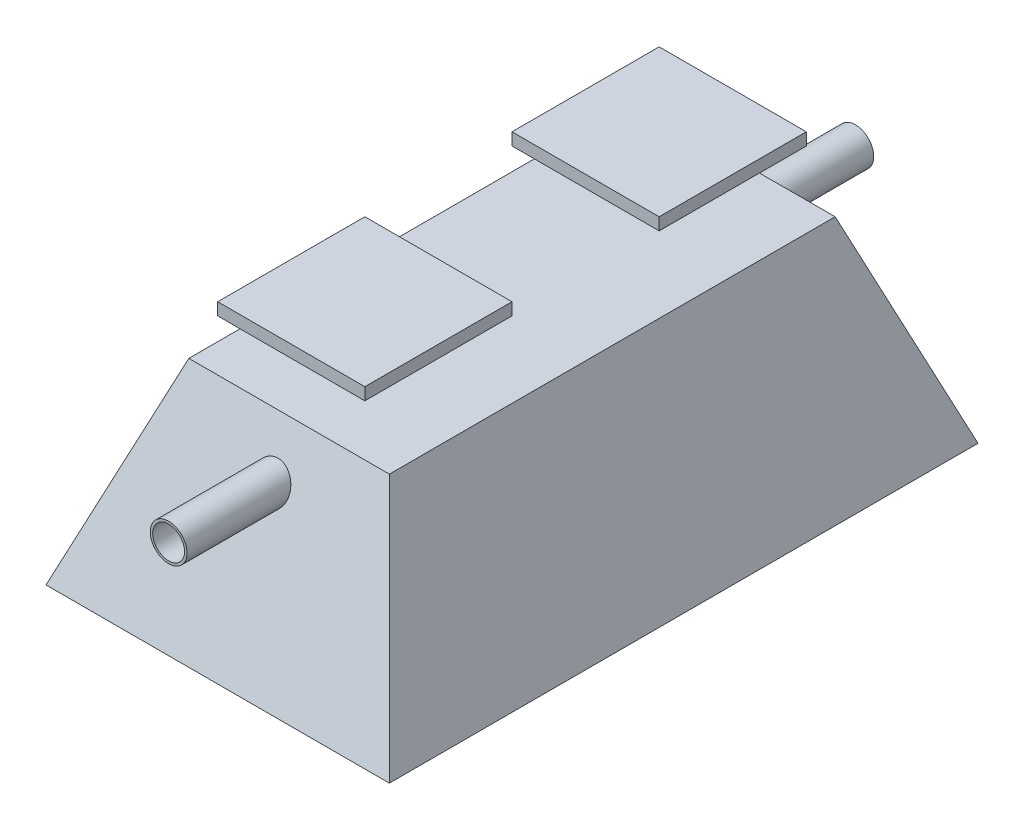
ISO-10303-21;
HEADER;
FILE_DESCRIPTION(('STEP AP214'),'2;1');
FILE_NAME('part.step','',(''),(''),'','','');
FILE_SCHEMA(('AUTOMOTIVE_DESIGN { 1 0 10303 214 1 1 1 1 }'));
ENDSEC;
DATA;
#1=APPLICATION_CONTEXT('core data for automotive mechanical design processes');
#2=APPLICATION_PROTOCOL_DEFINITION('international standard','automotive_design',2000,#1);
#3=PRODUCT_CONTEXT('',#1,'mechanical');
#4=PRODUCT('Part','Part','',(#3));
#5=PRODUCT_RELATED_PRODUCT_CATEGORY('part','',(#4));
#6=PRODUCT_DEFINITION_FORMATION('','',#4);
#7=PRODUCT_DEFINITION_CONTEXT('part definition',#1,'design');
#8=PRODUCT_DEFINITION('design','',#6,#7);
#9=PRODUCT_DEFINITION_SHAPE('','',#8);
#10=(LENGTH_UNIT() NAMED_UNIT(*) SI_UNIT(.MILLI.,.METRE.));
#11=(NAMED_UNIT(*) PLANE_ANGLE_UNIT() SI_UNIT($,.RADIAN.));
#12=(NAMED_UNIT(*) SI_UNIT($,.STERADIAN.) SOLID_ANGLE_UNIT());
#13=UNCERTAINTY_MEASURE_WITH_UNIT(LENGTH_MEASURE(1.E-05),#10,'distance_accuracy_value','');
#14=(GEOMETRIC_REPRESENTATION_CONTEXT(3) GLOBAL_UNCERTAINTY_ASSIGNED_CONTEXT((#13)) GLOBAL_UNIT_ASSIGNED_CONTEXT((#10,
#11,#12)) REPRESENTATION_CONTEXT('',''));
#15=CARTESIAN_POINT('',(0.,0.,0.));
#16=DIRECTION('',(0.,0.,1.));
#17=DIRECTION('',(1.,0.,0.));
#18=AXIS2_PLACEMENT_3D('',#15,#16,#17);
#19=CARTESIAN_POINT('',(175.096988457911,2.54,302.096988457911));
#20=DIRECTION('',(1.,0.,0.));
#21=DIRECTION('',(0.,0.,-1.));
#22=AXIS2_PLACEMENT_3D('',#19,#20,#21);
#23=PLANE('',#22);
#24=DIRECTION('',(0.,0.,1.));
#25=VECTOR('',#24,1.);
#26=CARTESIAN_POINT('',(175.096988457911,0.,302.096988457911));
#27=LINE('',#26,#25);
#28=CARTESIAN_POINT('',(175.096988457911,0.,-302.096988457911));
#29=VERTEX_POINT('',#28);
#30=CARTESIAN_POINT('',(175.096988457911,0.,302.096988457911));
#31=VERTEX_POINT('',#30);
#32=EDGE_CURVE('E112',#29,#31,#27,.T.);
#33=ORIENTED_EDGE('',*,*,#32,.F.);
#34=DIRECTION('',(0.,-1.,0.));
#35=VECTOR('',#34,1.);
#36=CARTESIAN_POINT('',(175.096988457911,2.54,-302.096988457911));
#37=LINE('',#36,#35);
#38=CARTESIAN_POINT('',(175.096988457911,2.54,-302.096988457911));
#39=VERTEX_POINT('',#38);
#40=EDGE_CURVE('E12',#39,#29,#37,.T.);
#41=ORIENTED_EDGE('',*,*,#40,.F.);
#42=DIRECTION('',(0.,0.,1.));
#43=VECTOR('',#42,1.);
#44=CARTESIAN_POINT('',(175.096988457911,2.54,302.096988457911));
#45=LINE('',#44,#43);
#46=CARTESIAN_POINT('',(175.096988457911,2.54,302.096988457911));
#47=VERTEX_POINT('',#46);
#48=EDGE_CURVE('E106',#39,#47,#45,.T.);
#49=ORIENTED_EDGE('',*,*,#48,.T.);
#50=DIRECTION('',(0.,-1.,0.));
#51=VECTOR('',#50,1.);
#52=CARTESIAN_POINT('',(175.096988457911,2.54,302.096988457911));
#53=LINE('',#52,#51);
#54=EDGE_CURVE('E51',#47,#31,#53,.T.);
#55=ORIENTED_EDGE('',*,*,#54,.T.);
#56=EDGE_LOOP('',(#33,#41,#49,#55));
#57=FACE_BOUND('',#56,.T.);
#58=ADVANCED_FACE('F48',(#57),#23,.T.);
#59=CARTESIAN_POINT('',(175.096988457911,2.54,-302.096988457911));
#60=DIRECTION('',(0.,0.,-1.));
#61=DIRECTION('',(-1.,0.,0.));
#62=AXIS2_PLACEMENT_3D('',#59,#60,#61);
#63=PLANE('',#62);
#64=DIRECTION('',(1.,0.,0.));
#65=VECTOR('',#64,1.);
#66=CARTESIAN_POINT('',(175.096988457911,0.,-302.096988457911));
#67=LINE('',#66,#65);
#68=CARTESIAN_POINT('',(-175.096988457911,0.,-302.096988457911));
#69=VERTEX_POINT('',#68);
#70=EDGE_CURVE('E108',#69,#29,#67,.T.);
#71=ORIENTED_EDGE('',*,*,#70,.F.);
#72=DIRECTION('',(0.,-1.,0.));
#73=VECTOR('',#72,1.);
#74=CARTESIAN_POINT('',(-175.096988457911,2.54,-302.096988457911));
#75=LINE('',#74,#73);
#76=CARTESIAN_POINT('',(-175.096988457911,2.54,-302.096988457911));
#77=VERTEX_POINT('',#76);
#78=EDGE_CURVE('E57',#77,#69,#75,.T.);
#79=ORIENTED_EDGE('',*,*,#78,.F.);
#80=DIRECTION('',(1.,0.,0.));
#81=VECTOR('',#80,1.);
#82=CARTESIAN_POINT('',(175.096988457911,2.54,-302.096988457911));
#83=LINE('',#82,#81);
#84=EDGE_CURVE('E103',#77,#39,#83,.T.);
#85=ORIENTED_EDGE('',*,*,#84,.T.);
#86=ORIENTED_EDGE('',*,*,#40,.T.);
#87=EDGE_LOOP('',(#71,#79,#85,#86));
#88=FACE_BOUND('',#87,.T.);
#89=ADVANCED_FACE('F122',(#88),#63,.T.);
#90=CARTESIAN_POINT('',(-175.096988457911,2.54,-302.096988457911));
#91=DIRECTION('',(-1.,0.,0.));
#92=DIRECTION('',(0.,0.,1.));
#93=AXIS2_PLACEMENT_3D('',#90,#91,#92);
#94=PLANE('',#93);
#95=DIRECTION('',(0.,0.,-1.));
#96=VECTOR('',#95,1.);
#97=CARTESIAN_POINT('',(-175.096988457911,0.,-302.096988457911));
#98=LINE('',#97,#96);
#99=CARTESIAN_POINT('',(-175.096988457911,0.,302.096988457911));
#100=VERTEX_POINT('',#99);
#101=EDGE_CURVE('E98',#100,#69,#98,.T.);
#102=ORIENTED_EDGE('',*,*,#101,.F.);
#103=DIRECTION('',(0.,-1.,0.));
#104=VECTOR('',#103,1.);
#105=CARTESIAN_POINT('',(-175.096988457911,2.54,302.096988457911));
#106=LINE('',#105,#104);
#107=CARTESIAN_POINT('',(-175.096988457911,2.54,302.096988457911));
#108=VERTEX_POINT('',#107);
#109=EDGE_CURVE('E93',#108,#100,#106,.T.);
#110=ORIENTED_EDGE('',*,*,#109,.F.);
#111=DIRECTION('',(0.,0.,-1.));
#112=VECTOR('',#111,1.);
#113=CARTESIAN_POINT('',(-175.096988457911,2.54,-302.096988457911));
#114=LINE('',#113,#112);
#115=EDGE_CURVE('E96',#108,#77,#114,.T.);
#116=ORIENTED_EDGE('',*,*,#115,.T.);
#117=ORIENTED_EDGE('',*,*,#78,.T.);
#118=EDGE_LOOP('',(#102,#110,#116,#117));
#119=FACE_BOUND('',#118,.T.);
#120=ADVANCED_FACE('F95',(#119),#94,.T.);
#121=CARTESIAN_POINT('',(-175.096988457911,2.54,302.096988457911));
#122=DIRECTION('',(0.,0.,1.));
#123=DIRECTION('',(1.,0.,0.));
#124=AXIS2_PLACEMENT_3D('',#121,#122,#123);
#125=PLANE('',#124);
#126=DIRECTION('',(-1.,0.,0.));
#127=VECTOR('',#126,1.);
#128=CARTESIAN_POINT('',(-175.096988457911,0.,302.096988457911));
#129=LINE('',#128,#127);
#130=EDGE_CURVE('E115',#31,#100,#129,.T.);
#131=ORIENTED_EDGE('',*,*,#130,.F.);
#132=ORIENTED_EDGE('',*,*,#54,.F.);
#133=DIRECTION('',(-1.,0.,0.));
#134=VECTOR('',#133,1.);
#135=CARTESIAN_POINT('',(-175.096988457911,2.54,302.096988457911));
#136=LINE('',#135,#134);
#137=EDGE_CURVE('E102',#47,#108,#136,.T.);
#138=ORIENTED_EDGE('',*,*,#137,.T.);
#139=ORIENTED_EDGE('',*,*,#109,.T.);
#140=EDGE_LOOP('',(#131,#132,#138,#139));
#141=FACE_BOUND('',#140,.T.);
#142=ADVANCED_FACE('F105',(#141),#125,.T.);
#143=CARTESIAN_POINT('',(0.,2.54,0.));
#144=DIRECTION('',(0.,1.,0.));
#145=DIRECTION('',(0.,0.,1.));
#146=AXIS2_PLACEMENT_3D('',#143,#144,#145);
#147=PLANE('',#146);
#148=ORIENTED_EDGE('',*,*,#48,.F.);
#149=ORIENTED_EDGE('',*,*,#84,.F.);
#150=ORIENTED_EDGE('',*,*,#115,.F.);
#151=ORIENTED_EDGE('',*,*,#137,.F.);
#152=EDGE_LOOP('',(#148,#149,#150,#151));
#153=FACE_BOUND('',#152,.T.);
#154=ADVANCED_FACE('F101',(#153),#147,.T.);
#155=CARTESIAN_POINT('',(0.,0.,0.));
#156=DIRECTION('',(0.,1.,0.));
#157=DIRECTION('',(0.,0.,1.));
#158=AXIS2_PLACEMENT_3D('',#155,#156,#157);
#159=PLANE('',#158);
#160=ORIENTED_EDGE('',*,*,#32,.T.);
#161=ORIENTED_EDGE('',*,*,#130,.T.);
#162=ORIENTED_EDGE('',*,*,#101,.T.);
#163=ORIENTED_EDGE('',*,*,#70,.T.);
#164=EDGE_LOOP('',(#160,#161,#162,#163));
#165=FACE_BOUND('',#164,.T.);
#166=ADVANCED_FACE('F121',(#165),#159,.F.);
#167=CLOSED_SHELL('',(#58,#89,#120,#142,#154,#166));
#168=MANIFOLD_SOLID_BREP('B2',#167);
#169=CARTESIAN_POINT('',(177.8,0.,-304.8));
#170=DIRECTION('',(0.939692620785908,0.342020143325669,0.));
#171=DIRECTION('',(-0.342020143325669,0.939692620785908,0.));
#172=AXIS2_PLACEMENT_3D('',#169,#170,#171);
#173=PLANE('',#172);
#174=DIRECTION('',(0.,0.,-1.));
#175=VECTOR('',#174,1.);
#176=CARTESIAN_POINT('',(177.8,0.,-304.8));
#177=LINE('',#176,#175);
#178=CARTESIAN_POINT('',(177.8,0.,304.8));
#179=VERTEX_POINT('',#178);
#180=CARTESIAN_POINT('',(177.8,0.,-304.8));
#181=VERTEX_POINT('',#180);
#182=EDGE_CURVE('E409',#179,#181,#177,.T.);
#183=ORIENTED_EDGE('',*,*,#182,.T.);
#184=DIRECTION('',(0.323615577118185,-0.889126490715988,-0.323615577118185));
#185=VECTOR('',#184,1.);
#186=CARTESIAN_POINT('',(140.559063952443,102.318630870018,-267.559063952443));
#187=LINE('',#186,#185);
#188=CARTESIAN_POINT('',(103.841248397107,203.2,-230.841248397108));
#189=VERTEX_POINT('',#188);
#190=EDGE_CURVE('E46',#189,#181,#187,.T.);
#191=ORIENTED_EDGE('',*,*,#190,.F.);
#192=DIRECTION('',(0.,0.,1.));
#193=VECTOR('',#192,1.);
#194=CARTESIAN_POINT('',(103.841248397107,203.2,-304.8));
#195=LINE('',#194,#193);
#196=CARTESIAN_POINT('',(103.841248397107,203.2,230.841248397108));
#197=VERTEX_POINT('',#196);
#198=EDGE_CURVE('E417',#197,#189,#195,.F.);
#199=ORIENTED_EDGE('',*,*,#198,.F.);
#200=DIRECTION('',(0.323615577118185,-0.889126490715988,0.323615577118185));
#201=VECTOR('',#200,1.);
#202=CARTESIAN_POINT('',(113.958395347044,175.403367205744,240.958395347044));
#203=LINE('',#202,#201);
#204=EDGE_CURVE('E419',#197,#179,#203,.T.);
#205=ORIENTED_EDGE('',*,*,#204,.T.);
#206=EDGE_LOOP('',(#183,#191,#199,#205));
#207=FACE_BOUND('',#206,.T.);
#208=ADVANCED_FACE('F171',(#207),#173,.T.);
#209=CARTESIAN_POINT('',(-177.8,0.,-304.8));
#210=DIRECTION('',(0.,0.342020143325669,-0.939692620785908));
#211=DIRECTION('',(0.,0.939692620785908,0.342020143325669));
#212=AXIS2_PLACEMENT_3D('',#209,#210,#211);
#213=PLANE('',#212);
#214=CARTESIAN_POINT('',(0.,152.4,-249.330936297831));
#215=DIRECTION('',(0.,0.342020143325669,-0.939692620785908));
#216=DIRECTION('',(0.,0.939692620785908,0.342020143325669));
#217=AXIS2_PLACEMENT_3D('',#214,#215,#216);
#218=ELLIPSE('',#217,20.2725865656661,19.05);
#219=CARTESIAN_POINT('',(0.,171.45,-242.397303335059));
#220=VERTEX_POINT('',#219);
#221=EDGE_CURVE('E406',#220,#220,#218,.F.);
#222=ORIENTED_EDGE('',*,*,#221,.T.);
#223=EDGE_LOOP('',(#222));
#224=FACE_BOUND('',#223,.T.);
#225=DIRECTION('',(-1.,0.,0.));
#226=VECTOR('',#225,1.);
#227=CARTESIAN_POINT('',(-177.8,0.,-304.8));
#228=LINE('',#227,#226);
#229=CARTESIAN_POINT('',(-177.8,0.,-304.8));
#230=VERTEX_POINT('',#229);
#231=EDGE_CURVE('E412',#181,#230,#228,.T.);
#232=ORIENTED_EDGE('',*,*,#231,.T.);
#233=DIRECTION('',(-0.323615577118185,-0.889126490715988,-0.323615577118185));
#234=VECTOR('',#233,1.);
#235=CARTESIAN_POINT('',(-177.8,0.,-304.8));
#236=LINE('',#235,#234);
#237=CARTESIAN_POINT('',(-103.841248397108,203.2,-230.841248397108));
#238=VERTEX_POINT('',#237);
#239=EDGE_CURVE('E180',#238,#230,#236,.T.);
#240=ORIENTED_EDGE('',*,*,#239,.F.);
#241=DIRECTION('',(1.,0.,0.));
#242=VECTOR('',#241,1.);
#243=CARTESIAN_POINT('',(-177.8,203.2,-230.841248397108));
#244=LINE('',#243,#242);
#245=EDGE_CURVE('E428',#189,#238,#244,.F.);
#246=ORIENTED_EDGE('',*,*,#245,.F.);
#247=ORIENTED_EDGE('',*,*,#190,.T.);
#248=EDGE_LOOP('',(#232,#240,#246,#247));
#249=FACE_BOUND('',#248,.T.);
#250=ADVANCED_FACE('F173',(#224,#249),#213,.T.);
#251=CARTESIAN_POINT('',(-177.8,0.,-304.8));
#252=DIRECTION('',(-0.939692620785908,0.342020143325669,0.));
#253=DIRECTION('',(-0.342020143325669,-0.939692620785908,0.));
#254=AXIS2_PLACEMENT_3D('',#251,#252,#253);
#255=PLANE('',#254);
#256=DIRECTION('',(0.,0.,1.));
#257=VECTOR('',#256,1.);
#258=CARTESIAN_POINT('',(-177.8,0.,-304.8));
#259=LINE('',#258,#257);
#260=CARTESIAN_POINT('',(-177.8,0.,304.8));
#261=VERTEX_POINT('',#260);
#262=EDGE_CURVE('E414',#230,#261,#259,.T.);
#263=ORIENTED_EDGE('',*,*,#262,.T.);
#264=DIRECTION('',(-0.323615577118185,-0.889126490715988,0.323615577118185));
#265=VECTOR('',#264,1.);
#266=CARTESIAN_POINT('',(-177.8,0.,304.8));
#267=LINE('',#266,#265);
#268=CARTESIAN_POINT('',(-103.841248397108,203.2,230.841248397108));
#269=VERTEX_POINT('',#268);
#270=EDGE_CURVE('E422',#269,#261,#267,.T.);
#271=ORIENTED_EDGE('',*,*,#270,.F.);
#272=DIRECTION('',(0.,0.,-1.));
#273=VECTOR('',#272,1.);
#274=CARTESIAN_POINT('',(-103.841248397108,203.2,-304.8));
#275=LINE('',#274,#273);
#276=EDGE_CURVE('E430',#238,#269,#275,.F.);
#277=ORIENTED_EDGE('',*,*,#276,.F.);
#278=ORIENTED_EDGE('',*,*,#239,.T.);
#279=EDGE_LOOP('',(#263,#271,#277,#278));
#280=FACE_BOUND('',#279,.T.);
#281=ADVANCED_FACE('F436',(#280),#255,.T.);
#282=CARTESIAN_POINT('',(-177.8,0.,304.8));
#283=DIRECTION('',(0.,0.342020143325669,0.939692620785908));
#284=DIRECTION('',(0.,-0.939692620785908,0.342020143325669));
#285=AXIS2_PLACEMENT_3D('',#282,#283,#284);
#286=PLANE('',#285);
#287=CARTESIAN_POINT('',(0.,152.4,249.330936297831));
#288=DIRECTION('',(0.,0.342020143325669,0.939692620785908));
#289=DIRECTION('',(0.,-0.939692620785908,0.342020143325669));
#290=AXIS2_PLACEMENT_3D('',#287,#288,#289);
#291=ELLIPSE('',#290,20.2725865656661,19.05);
#292=CARTESIAN_POINT('',(0.,133.35,256.264569260602));
#293=VERTEX_POINT('',#292);
#294=EDGE_CURVE('E175',#293,#293,#291,.F.);
#295=ORIENTED_EDGE('',*,*,#294,.T.);
#296=EDGE_LOOP('',(#295));
#297=FACE_BOUND('',#296,.T.);
#298=DIRECTION('',(1.,0.,0.));
#299=VECTOR('',#298,1.);
#300=CARTESIAN_POINT('',(-177.8,0.,304.8));
#301=LINE('',#300,#299);
#302=EDGE_CURVE('E416',#261,#179,#301,.T.);
#303=ORIENTED_EDGE('',*,*,#302,.T.);
#304=ORIENTED_EDGE('',*,*,#204,.F.);
#305=DIRECTION('',(-1.,0.,0.));
#306=VECTOR('',#305,1.);
#307=CARTESIAN_POINT('',(-177.8,203.2,230.841248397108));
#308=LINE('',#307,#306);
#309=EDGE_CURVE('E196',#269,#197,#308,.F.);
#310=ORIENTED_EDGE('',*,*,#309,.F.);
#311=ORIENTED_EDGE('',*,*,#270,.T.);
#312=EDGE_LOOP('',(#303,#304,#310,#311));
#313=FACE_BOUND('',#312,.T.);
#314=ADVANCED_FACE('F440',(#297,#313),#286,.T.);
#315=CARTESIAN_POINT('',(0.,203.2,0.));
#316=DIRECTION('',(0.,1.,0.));
#317=DIRECTION('',(0.,0.,1.));
#318=AXIS2_PLACEMENT_3D('',#315,#316,#317);
#319=PLANE('',#318);
#320=CARTESIAN_POINT('',(0.,203.2,152.4));
#321=DIRECTION('',(0.,1.,0.));
#322=DIRECTION('',(0.,0.,1.));
#323=AXIS2_PLACEMENT_3D('',#320,#321,#322);
#324=CIRCLE('',#323,6.35);
#325=CARTESIAN_POINT('',(0.,203.2,158.75));
#326=VERTEX_POINT('',#325);
#327=EDGE_CURVE('E348',#326,#326,#324,.T.);
#328=ORIENTED_EDGE('',*,*,#327,.F.);
#329=EDGE_LOOP('',(#328));
#330=FACE_BOUND('',#329,.T.);
#331=CARTESIAN_POINT('',(0.,203.2,-152.4));
#332=DIRECTION('',(0.,1.,0.));
#333=DIRECTION('',(0.,0.,1.));
#334=AXIS2_PLACEMENT_3D('',#331,#332,#333);
#335=CIRCLE('',#334,6.35);
#336=CARTESIAN_POINT('',(0.,203.2,-146.05));
#337=VERTEX_POINT('',#336);
#338=EDGE_CURVE('E352',#337,#337,#335,.T.);
#339=ORIENTED_EDGE('',*,*,#338,.F.);
#340=EDGE_LOOP('',(#339));
#341=FACE_BOUND('',#340,.T.);
#342=ORIENTED_EDGE('',*,*,#198,.T.);
#343=ORIENTED_EDGE('',*,*,#245,.T.);
#344=ORIENTED_EDGE('',*,*,#276,.T.);
#345=ORIENTED_EDGE('',*,*,#309,.T.);
#346=EDGE_LOOP('',(#342,#343,#344,#345));
#347=FACE_BOUND('',#346,.T.);
#348=ADVANCED_FACE('F433',(#330,#341,#347),#319,.T.);
#349=CARTESIAN_POINT('',(0.,0.,0.));
#350=DIRECTION('',(0.,1.,0.));
#351=DIRECTION('',(0.,0.,1.));
#352=AXIS2_PLACEMENT_3D('',#349,#350,#351);
#353=PLANE('',#352);
#354=DIRECTION('',(-1.,0.,0.));
#355=VECTOR('',#354,1.);
#356=CARTESIAN_POINT('',(-177.8,0.,302.096988457911));
#357=LINE('',#356,#355);
#358=CARTESIAN_POINT('',(-175.096988457911,0.,302.096988457911));
#359=VERTEX_POINT('',#358);
#360=CARTESIAN_POINT('',(175.096988457911,0.,302.096988457911));
#361=VERTEX_POINT('',#360);
#362=EDGE_CURVE('E376',#359,#361,#357,.F.);
#363=ORIENTED_EDGE('',*,*,#362,.T.);
#364=DIRECTION('',(0.,0.,1.));
#365=VECTOR('',#364,1.);
#366=CARTESIAN_POINT('',(175.096988457911,0.,-304.8));
#367=LINE('',#366,#365);
#368=CARTESIAN_POINT('',(175.096988457911,0.,-302.096988457911));
#369=VERTEX_POINT('',#368);
#370=EDGE_CURVE('E384',#361,#369,#367,.F.);
#371=ORIENTED_EDGE('',*,*,#370,.T.);
#372=DIRECTION('',(1.,0.,0.));
#373=VECTOR('',#372,1.);
#374=CARTESIAN_POINT('',(-177.8,0.,-302.096988457911));
#375=LINE('',#374,#373);
#376=CARTESIAN_POINT('',(-175.096988457911,0.,-302.096988457911));
#377=VERTEX_POINT('',#376);
#378=EDGE_CURVE('E395',#369,#377,#375,.F.);
#379=ORIENTED_EDGE('',*,*,#378,.T.);
#380=DIRECTION('',(0.,0.,-1.));
#381=VECTOR('',#380,1.);
#382=CARTESIAN_POINT('',(-175.096988457911,0.,-304.8));
#383=LINE('',#382,#381);
#384=EDGE_CURVE('E188',#377,#359,#383,.F.);
#385=ORIENTED_EDGE('',*,*,#384,.T.);
#386=EDGE_LOOP('',(#363,#371,#379,#385));
#387=FACE_BOUND('',#386,.T.);
#388=ORIENTED_EDGE('',*,*,#182,.F.);
#389=ORIENTED_EDGE('',*,*,#302,.F.);
#390=ORIENTED_EDGE('',*,*,#262,.F.);
#391=ORIENTED_EDGE('',*,*,#231,.F.);
#392=EDGE_LOOP('',(#388,#389,#390,#391));
#393=FACE_BOUND('',#392,.T.);
#394=ADVANCED_FACE('F447',(#387,#393),#353,.F.);
#395=CARTESIAN_POINT('',(0.,152.4,-355.6));
#396=DIRECTION('',(0.,0.,1.));
#397=DIRECTION('',(1.,0.,0.));
#398=AXIS2_PLACEMENT_3D('',#395,#396,#397);
#399=CYLINDRICAL_SURFACE('',#398,19.05);
#400=CARTESIAN_POINT('',(0.,152.4,355.6));
#401=DIRECTION('',(0.,0.,1.));
#402=DIRECTION('',(1.,0.,0.));
#403=AXIS2_PLACEMENT_3D('',#400,#401,#402);
#404=CIRCLE('',#403,19.05);
#405=CARTESIAN_POINT('',(19.05,152.4,355.6));
#406=VERTEX_POINT('',#405);
#407=EDGE_CURVE('E370',#406,#406,#404,.T.);
#408=ORIENTED_EDGE('',*,*,#407,.F.);
#409=EDGE_LOOP('',(#408));
#410=FACE_BOUND('',#409,.T.);
#411=ORIENTED_EDGE('',*,*,#294,.F.);
#412=EDGE_LOOP('',(#411));
#413=FACE_BOUND('',#412,.T.);
#414=ADVANCED_FACE('F449',(#410,#413),#399,.T.);
#415=CARTESIAN_POINT('',(0.,152.4,355.6));
#416=DIRECTION('',(0.,0.,1.));
#417=DIRECTION('',(1.,0.,0.));
#418=AXIS2_PLACEMENT_3D('',#415,#416,#417);
#419=PLANE('',#418);
#420=CARTESIAN_POINT('',(0.,152.4,355.6));
#421=DIRECTION('',(0.,0.,-1.));
#422=DIRECTION('',(-1.,0.,0.));
#423=AXIS2_PLACEMENT_3D('',#420,#421,#422);
#424=CIRCLE('',#423,16.51);
#425=CARTESIAN_POINT('',(-16.51,152.4,355.6));
#426=VERTEX_POINT('',#425);
#427=EDGE_CURVE('E363',#426,#426,#424,.T.);
#428=ORIENTED_EDGE('',*,*,#427,.T.);
#429=EDGE_LOOP('',(#428));
#430=FACE_BOUND('',#429,.T.);
#431=ORIENTED_EDGE('',*,*,#407,.T.);
#432=EDGE_LOOP('',(#431));
#433=FACE_BOUND('',#432,.T.);
#434=ADVANCED_FACE('F456',(#430,#433),#419,.T.);
#435=CARTESIAN_POINT('',(0.,152.4,-355.6));
#436=DIRECTION('',(0.,0.,1.));
#437=DIRECTION('',(1.,0.,0.));
#438=AXIS2_PLACEMENT_3D('',#435,#436,#437);
#439=CIRCLE('',#438,19.05);
#440=CARTESIAN_POINT('',(19.05,152.4,-355.6));
#441=VERTEX_POINT('',#440);
#442=EDGE_CURVE('E403',#441,#441,#439,.T.);
#443=ORIENTED_EDGE('',*,*,#442,.T.);
#444=EDGE_LOOP('',(#443));
#445=FACE_BOUND('',#444,.T.);
#446=ORIENTED_EDGE('',*,*,#221,.F.);
#447=EDGE_LOOP('',(#446));
#448=FACE_BOUND('',#447,.T.);
#449=ADVANCED_FACE('F459',(#445,#448),#399,.T.);
#450=CARTESIAN_POINT('',(0.,152.4,-355.6));
#451=DIRECTION('',(0.,0.,1.));
#452=DIRECTION('',(1.,0.,0.));
#453=AXIS2_PLACEMENT_3D('',#450,#451,#452);
#454=PLANE('',#453);
#455=CARTESIAN_POINT('',(0.,152.4,-355.6));
#456=DIRECTION('',(0.,0.,-1.));
#457=DIRECTION('',(-1.,0.,0.));
#458=AXIS2_PLACEMENT_3D('',#455,#456,#457);
#459=CIRCLE('',#458,16.51);
#460=CARTESIAN_POINT('',(-16.51,152.4,-355.6));
#461=VERTEX_POINT('',#460);
#462=EDGE_CURVE('E358',#461,#461,#459,.T.);
#463=ORIENTED_EDGE('',*,*,#462,.F.);
#464=EDGE_LOOP('',(#463));
#465=FACE_BOUND('',#464,.T.);
#466=ORIENTED_EDGE('',*,*,#442,.F.);
#467=EDGE_LOOP('',(#466));
#468=FACE_BOUND('',#467,.T.);
#469=ADVANCED_FACE('F636',(#465,#468),#454,.F.);
#470=CARTESIAN_POINT('',(175.413180743204,-0.8687311640472,-304.8));
#471=DIRECTION('',(0.939692620785908,0.342020143325669,0.));
#472=DIRECTION('',(-0.342020143325669,0.939692620785908,0.));
#473=AXIS2_PLACEMENT_3D('',#470,#471,#472);
#474=PLANE('',#473);
#475=ORIENTED_EDGE('',*,*,#370,.F.);
#476=DIRECTION('',(0.323615577118185,-0.889126490715988,0.323615577118185));
#477=VECTOR('',#476,1.);
#478=CARTESIAN_POINT('',(111.821540610213,173.847864167429,238.821540610213));
#479=LINE('',#478,#477);
#480=CARTESIAN_POINT('',(102.062721250055,200.66,229.062721250055));
#481=VERTEX_POINT('',#480);
#482=EDGE_CURVE('E377',#481,#361,#479,.T.);
#483=ORIENTED_EDGE('',*,*,#482,.F.);
#484=DIRECTION('',(0.,0.,1.));
#485=VECTOR('',#484,1.);
#486=CARTESIAN_POINT('',(102.062721250055,200.66,-304.8));
#487=LINE('',#486,#485);
#488=CARTESIAN_POINT('',(102.062721250055,200.66,-229.062721250055));
#489=VERTEX_POINT('',#488);
#490=EDGE_CURVE('E372',#481,#489,#487,.F.);
#491=ORIENTED_EDGE('',*,*,#490,.T.);
#492=DIRECTION('',(0.323615577118185,-0.889126490715988,-0.323615577118185));
#493=VECTOR('',#492,1.);
#494=CARTESIAN_POINT('',(138.422209215611,100.763127831703,-265.422209215611));
#495=LINE('',#494,#493);
#496=EDGE_CURVE('E367',#489,#369,#495,.T.);
#497=ORIENTED_EDGE('',*,*,#496,.T.);
#498=EDGE_LOOP('',(#475,#483,#491,#497));
#499=FACE_BOUND('',#498,.T.);
#500=ADVANCED_FACE('F632',(#499),#474,.F.);
#501=CARTESIAN_POINT('',(-177.8,-0.8687311640472,-302.413180743204));
#502=DIRECTION('',(0.,0.342020143325669,-0.939692620785908));
#503=DIRECTION('',(0.,0.939692620785908,0.342020143325669));
#504=AXIS2_PLACEMENT_3D('',#501,#502,#503);
#505=PLANE('',#504);
#506=CARTESIAN_POINT('',(0.,152.4,-246.627924755742));
#507=DIRECTION('',(0.,0.342020143325669,-0.939692620785908));
#508=DIRECTION('',(0.,0.939692620785908,0.342020143325669));
#509=AXIS2_PLACEMENT_3D('',#506,#507,#508);
#510=ELLIPSE('',#509,17.5695750235773,16.51);
#511=CARTESIAN_POINT('',(0.,168.91,-240.618776188007));
#512=VERTEX_POINT('',#511);
#513=EDGE_CURVE('E381',#512,#512,#510,.F.);
#514=ORIENTED_EDGE('',*,*,#513,.F.);
#515=EDGE_LOOP('',(#514));
#516=FACE_BOUND('',#515,.T.);
#517=ORIENTED_EDGE('',*,*,#378,.F.);
#518=ORIENTED_EDGE('',*,*,#496,.F.);
#519=DIRECTION('',(1.,0.,0.));
#520=VECTOR('',#519,1.);
#521=CARTESIAN_POINT('',(-177.8,200.66,-229.062721250055));
#522=LINE('',#521,#520);
#523=CARTESIAN_POINT('',(-102.062721250055,200.66,-229.062721250055));
#524=VERTEX_POINT('',#523);
#525=EDGE_CURVE('E375',#489,#524,#522,.F.);
#526=ORIENTED_EDGE('',*,*,#525,.T.);
#527=DIRECTION('',(-0.323615577118185,-0.889126490715988,-0.323615577118185));
#528=VECTOR('',#527,1.);
#529=CARTESIAN_POINT('',(-175.663145263169,-1.55550303831485,-302.663145263168));
#530=LINE('',#529,#528);
#531=EDGE_CURVE('E371',#524,#377,#530,.T.);
#532=ORIENTED_EDGE('',*,*,#531,.T.);
#533=EDGE_LOOP('',(#517,#518,#526,#532));
#534=FACE_BOUND('',#533,.T.);
#535=ADVANCED_FACE('F635',(#516,#534),#505,.F.);
#536=CARTESIAN_POINT('',(-175.413180743204,-0.8687311640472,-304.8));
#537=DIRECTION('',(-0.939692620785908,0.342020143325669,0.));
#538=DIRECTION('',(-0.342020143325669,-0.939692620785908,0.));
#539=AXIS2_PLACEMENT_3D('',#536,#537,#538);
#540=PLANE('',#539);
#541=ORIENTED_EDGE('',*,*,#384,.F.);
#542=ORIENTED_EDGE('',*,*,#531,.F.);
#543=DIRECTION('',(0.,0.,-1.));
#544=VECTOR('',#543,1.);
#545=CARTESIAN_POINT('',(-102.062721250055,200.66,-304.8));
#546=LINE('',#545,#544);
#547=CARTESIAN_POINT('',(-102.062721250055,200.66,229.062721250055));
#548=VERTEX_POINT('',#547);
#549=EDGE_CURVE('E387',#524,#548,#546,.F.);
#550=ORIENTED_EDGE('',*,*,#549,.T.);
#551=DIRECTION('',(-0.323615577118185,-0.889126490715988,0.323615577118185));
#552=VECTOR('',#551,1.);
#553=CARTESIAN_POINT('',(-175.663145263169,-1.55550303831486,302.663145263168));
#554=LINE('',#553,#552);
#555=EDGE_CURVE('E379',#548,#359,#554,.T.);
#556=ORIENTED_EDGE('',*,*,#555,.T.);
#557=EDGE_LOOP('',(#541,#542,#550,#556));
#558=FACE_BOUND('',#557,.T.);
#559=ADVANCED_FACE('F640',(#558),#540,.F.);
#560=CARTESIAN_POINT('',(-177.8,-0.8687311640472,302.413180743204));
#561=DIRECTION('',(0.,0.342020143325669,0.939692620785908));
#562=DIRECTION('',(0.,-0.939692620785908,0.342020143325669));
#563=AXIS2_PLACEMENT_3D('',#560,#561,#562);
#564=PLANE('',#563);
#565=CARTESIAN_POINT('',(0.,152.4,246.627924755742));
#566=DIRECTION('',(0.,0.342020143325669,0.939692620785908));
#567=DIRECTION('',(0.,-0.939692620785908,0.342020143325669));
#568=AXIS2_PLACEMENT_3D('',#565,#566,#567);
#569=ELLIPSE('',#568,17.5695750235773,16.51);
#570=CARTESIAN_POINT('',(0.,135.89,252.637073323477));
#571=VERTEX_POINT('',#570);
#572=EDGE_CURVE('E366',#571,#571,#569,.F.);
#573=ORIENTED_EDGE('',*,*,#572,.F.);
#574=EDGE_LOOP('',(#573));
#575=FACE_BOUND('',#574,.T.);
#576=ORIENTED_EDGE('',*,*,#362,.F.);
#577=ORIENTED_EDGE('',*,*,#555,.F.);
#578=DIRECTION('',(-1.,0.,0.));
#579=VECTOR('',#578,1.);
#580=CARTESIAN_POINT('',(-177.8,200.66,229.062721250055));
#581=LINE('',#580,#579);
#582=EDGE_CURVE('E380',#548,#481,#581,.F.);
#583=ORIENTED_EDGE('',*,*,#582,.T.);
#584=ORIENTED_EDGE('',*,*,#482,.T.);
#585=EDGE_LOOP('',(#576,#577,#583,#584));
#586=FACE_BOUND('',#585,.T.);
#587=ADVANCED_FACE('F644',(#575,#586),#564,.F.);
#588=CARTESIAN_POINT('',(0.,200.66,0.));
#589=DIRECTION('',(0.,1.,0.));
#590=DIRECTION('',(0.,0.,1.));
#591=AXIS2_PLACEMENT_3D('',#588,#589,#590);
#592=PLANE('',#591);
#593=ORIENTED_EDGE('',*,*,#490,.F.);
#594=ORIENTED_EDGE('',*,*,#582,.F.);
#595=ORIENTED_EDGE('',*,*,#549,.F.);
#596=ORIENTED_EDGE('',*,*,#525,.F.);
#597=EDGE_LOOP('',(#593,#594,#595,#596));
#598=FACE_BOUND('',#597,.T.);
#599=ADVANCED_FACE('F647',(#598),#592,.F.);
#600=CARTESIAN_POINT('',(0.,152.4,-355.6));
#601=DIRECTION('',(0.,0.,1.));
#602=DIRECTION('',(1.,0.,0.));
#603=AXIS2_PLACEMENT_3D('',#600,#601,#602);
#604=CYLINDRICAL_SURFACE('',#603,16.51);
#605=ORIENTED_EDGE('',*,*,#572,.T.);
#606=EDGE_LOOP('',(#605));
#607=FACE_BOUND('',#606,.T.);
#608=ORIENTED_EDGE('',*,*,#427,.F.);
#609=EDGE_LOOP('',(#608));
#610=FACE_BOUND('',#609,.T.);
#611=ADVANCED_FACE('F651',(#607,#610),#604,.F.);
#612=ORIENTED_EDGE('',*,*,#513,.T.);
#613=EDGE_LOOP('',(#612));
#614=FACE_BOUND('',#613,.T.);
#615=ORIENTED_EDGE('',*,*,#462,.T.);
#616=EDGE_LOOP('',(#615));
#617=FACE_BOUND('',#616,.T.);
#618=ADVANCED_FACE('F492',(#614,#617),#604,.F.);
#619=CARTESIAN_POINT('',(0.,254.,-152.4));
#620=DIRECTION('',(0.,-1.,0.));
#621=DIRECTION('',(0.,0.,-1.));
#622=AXIS2_PLACEMENT_3D('',#619,#620,#621);
#623=CYLINDRICAL_SURFACE('',#622,6.35);
#624=CARTESIAN_POINT('',(0.,254.,-152.4));
#625=DIRECTION('',(0.,1.,0.));
#626=DIRECTION('',(0.,0.,1.));
#627=AXIS2_PLACEMENT_3D('',#624,#625,#626);
#628=CIRCLE('',#627,6.35);
#629=CARTESIAN_POINT('',(0.,254.,-146.05));
#630=VERTEX_POINT('',#629);
#631=EDGE_CURVE('E355',#630,#630,#628,.T.);
#632=ORIENTED_EDGE('',*,*,#631,.F.);
#633=EDGE_LOOP('',(#632));
#634=FACE_BOUND('',#633,.T.);
#635=ORIENTED_EDGE('',*,*,#338,.T.);
#636=EDGE_LOOP('',(#635));
#637=FACE_BOUND('',#636,.T.);
#638=ADVANCED_FACE('F497',(#634,#637),#623,.T.);
#639=CARTESIAN_POINT('',(0.,254.,152.4));
#640=DIRECTION('',(0.,-1.,0.));
#641=DIRECTION('',(0.,0.,-1.));
#642=AXIS2_PLACEMENT_3D('',#639,#640,#641);
#643=CYLINDRICAL_SURFACE('',#642,6.35);
#644=CARTESIAN_POINT('',(0.,254.,152.4));
#645=DIRECTION('',(0.,1.,0.));
#646=DIRECTION('',(0.,0.,1.));
#647=AXIS2_PLACEMENT_3D('',#644,#645,#646);
#648=CIRCLE('',#647,6.35);
#649=CARTESIAN_POINT('',(0.,254.,158.75));
#650=VERTEX_POINT('',#649);
#651=EDGE_CURVE('E349',#650,#650,#648,.T.);
#652=ORIENTED_EDGE('',*,*,#651,.F.);
#653=EDGE_LOOP('',(#652));
#654=FACE_BOUND('',#653,.T.);
#655=ORIENTED_EDGE('',*,*,#327,.T.);
#656=EDGE_LOOP('',(#655));
#657=FACE_BOUND('',#656,.T.);
#658=ADVANCED_FACE('F502',(#654,#657),#643,.T.);
#659=CARTESIAN_POINT('',(76.2,266.7,-228.6));
#660=DIRECTION('',(-1.,0.,0.));
#661=DIRECTION('',(0.,0.,1.));
#662=AXIS2_PLACEMENT_3D('',#659,#660,#661);
#663=PLANE('',#662);
#664=DIRECTION('',(0.,0.,-1.));
#665=VECTOR('',#664,1.);
#666=CARTESIAN_POINT('',(76.2,254.,-228.6));
#667=LINE('',#666,#665);
#668=CARTESIAN_POINT('',(76.2,254.,-76.2));
#669=VERTEX_POINT('',#668);
#670=CARTESIAN_POINT('',(76.2,254.,-228.6));
#671=VERTEX_POINT('',#670);
#672=EDGE_CURVE('E313',#669,#671,#667,.T.);
#673=ORIENTED_EDGE('',*,*,#672,.T.);
#674=DIRECTION('',(0.,-1.,0.));
#675=VECTOR('',#674,1.);
#676=CARTESIAN_POINT('',(76.2,266.7,-228.6));
#677=LINE('',#676,#675);
#678=CARTESIAN_POINT('',(76.2,266.7,-228.6));
#679=VERTEX_POINT('',#678);
#680=EDGE_CURVE('E345',#679,#671,#677,.T.);
#681=ORIENTED_EDGE('',*,*,#680,.F.);
#682=DIRECTION('',(0.,0.,-1.));
#683=VECTOR('',#682,1.);
#684=CARTESIAN_POINT('',(76.2,266.7,-228.6));
#685=LINE('',#684,#683);
#686=CARTESIAN_POINT('',(76.2,266.7,-76.2));
#687=VERTEX_POINT('',#686);
#688=EDGE_CURVE('E322',#687,#679,#685,.T.);
#689=ORIENTED_EDGE('',*,*,#688,.F.);
#690=DIRECTION('',(0.,-1.,0.));
#691=VECTOR('',#690,1.);
#692=CARTESIAN_POINT('',(76.2,266.7,-76.2));
#693=LINE('',#692,#691);
#694=EDGE_CURVE('E331',#687,#669,#693,.T.);
#695=ORIENTED_EDGE('',*,*,#694,.T.);
#696=EDGE_LOOP('',(#673,#681,#689,#695));
#697=FACE_BOUND('',#696,.T.);
#698=ADVANCED_FACE('F512',(#697),#663,.F.);
#699=CARTESIAN_POINT('',(-76.2,266.7,-228.6));
#700=DIRECTION('',(0.,0.,1.));
#701=DIRECTION('',(1.,0.,0.));
#702=AXIS2_PLACEMENT_3D('',#699,#700,#701);
#703=PLANE('',#702);
#704=DIRECTION('',(-1.,0.,0.));
#705=VECTOR('',#704,1.);
#706=CARTESIAN_POINT('',(-76.2,254.,-228.6));
#707=LINE('',#706,#705);
#708=CARTESIAN_POINT('',(-76.2,254.,-228.6));
#709=VERTEX_POINT('',#708);
#710=EDGE_CURVE('E316',#671,#709,#707,.T.);
#711=ORIENTED_EDGE('',*,*,#710,.T.);
#712=DIRECTION('',(0.,-1.,0.));
#713=VECTOR('',#712,1.);
#714=CARTESIAN_POINT('',(-76.2,266.7,-228.6));
#715=LINE('',#714,#713);
#716=CARTESIAN_POINT('',(-76.2,266.7,-228.6));
#717=VERTEX_POINT('',#716);
#718=EDGE_CURVE('E342',#717,#709,#715,.T.);
#719=ORIENTED_EDGE('',*,*,#718,.F.);
#720=DIRECTION('',(-1.,0.,0.));
#721=VECTOR('',#720,1.);
#722=CARTESIAN_POINT('',(-76.2,266.7,-228.6));
#723=LINE('',#722,#721);
#724=EDGE_CURVE('E325',#679,#717,#723,.T.);
#725=ORIENTED_EDGE('',*,*,#724,.F.);
#726=ORIENTED_EDGE('',*,*,#680,.T.);
#727=EDGE_LOOP('',(#711,#719,#725,#726));
#728=FACE_BOUND('',#727,.T.);
#729=ADVANCED_FACE('F522',(#728),#703,.F.);
#730=CARTESIAN_POINT('',(-76.2,266.7,-228.6));
#731=DIRECTION('',(1.,0.,0.));
#732=DIRECTION('',(0.,0.,-1.));
#733=AXIS2_PLACEMENT_3D('',#730,#731,#732);
#734=PLANE('',#733);
#735=DIRECTION('',(0.,0.,1.));
#736=VECTOR('',#735,1.);
#737=CARTESIAN_POINT('',(-76.2,254.,-228.6));
#738=LINE('',#737,#736);
#739=CARTESIAN_POINT('',(-76.2,254.,-76.2));
#740=VERTEX_POINT('',#739);
#741=EDGE_CURVE('E334',#709,#740,#738,.T.);
#742=ORIENTED_EDGE('',*,*,#741,.T.);
#743=DIRECTION('',(0.,-1.,0.));
#744=VECTOR('',#743,1.);
#745=CARTESIAN_POINT('',(-76.2,266.7,-76.2));
#746=LINE('',#745,#744);
#747=CARTESIAN_POINT('',(-76.2,266.7,-76.2));
#748=VERTEX_POINT('',#747);
#749=EDGE_CURVE('E339',#748,#740,#746,.T.);
#750=ORIENTED_EDGE('',*,*,#749,.F.);
#751=DIRECTION('',(0.,0.,1.));
#752=VECTOR('',#751,1.);
#753=CARTESIAN_POINT('',(-76.2,266.7,-228.6));
#754=LINE('',#753,#752);
#755=EDGE_CURVE('E328',#717,#748,#754,.T.);
#756=ORIENTED_EDGE('',*,*,#755,.F.);
#757=ORIENTED_EDGE('',*,*,#718,.T.);
#758=EDGE_LOOP('',(#742,#750,#756,#757));
#759=FACE_BOUND('',#758,.T.);
#760=ADVANCED_FACE('F532',(#759),#734,.F.);
#761=CARTESIAN_POINT('',(-76.2,266.7,-76.2));
#762=DIRECTION('',(0.,0.,-1.));
#763=DIRECTION('',(-1.,0.,0.));
#764=AXIS2_PLACEMENT_3D('',#761,#762,#763);
#765=PLANE('',#764);
#766=DIRECTION('',(1.,0.,0.));
#767=VECTOR('',#766,1.);
#768=CARTESIAN_POINT('',(-76.2,254.,-76.2));
#769=LINE('',#768,#767);
#770=EDGE_CURVE('E326',#740,#669,#769,.T.);
#771=ORIENTED_EDGE('',*,*,#770,.T.);
#772=ORIENTED_EDGE('',*,*,#694,.F.);
#773=DIRECTION('',(1.,0.,0.));
#774=VECTOR('',#773,1.);
#775=CARTESIAN_POINT('',(-76.2,266.7,-76.2));
#776=LINE('',#775,#774);
#777=EDGE_CURVE('E330',#748,#687,#776,.T.);
#778=ORIENTED_EDGE('',*,*,#777,.F.);
#779=ORIENTED_EDGE('',*,*,#749,.T.);
#780=EDGE_LOOP('',(#771,#772,#778,#779));
#781=FACE_BOUND('',#780,.T.);
#782=ADVANCED_FACE('F542',(#781),#765,.F.);
#783=CARTESIAN_POINT('',(0.,266.7,0.));
#784=DIRECTION('',(0.,1.,0.));
#785=DIRECTION('',(0.,0.,1.));
#786=AXIS2_PLACEMENT_3D('',#783,#784,#785);
#787=PLANE('',#786);
#788=ORIENTED_EDGE('',*,*,#688,.T.);
#789=ORIENTED_EDGE('',*,*,#724,.T.);
#790=ORIENTED_EDGE('',*,*,#755,.T.);
#791=ORIENTED_EDGE('',*,*,#777,.T.);
#792=EDGE_LOOP('',(#788,#789,#790,#791));
#793=FACE_BOUND('',#792,.T.);
#794=ADVANCED_FACE('F552',(#793),#787,.T.);
#795=CARTESIAN_POINT('',(0.,254.,0.));
#796=DIRECTION('',(0.,1.,0.));
#797=DIRECTION('',(0.,0.,1.));
#798=AXIS2_PLACEMENT_3D('',#795,#796,#797);
#799=PLANE('',#798);
#800=ORIENTED_EDGE('',*,*,#631,.T.);
#801=EDGE_LOOP('',(#800));
#802=FACE_BOUND('',#801,.T.);
#803=ORIENTED_EDGE('',*,*,#672,.F.);
#804=ORIENTED_EDGE('',*,*,#770,.F.);
#805=ORIENTED_EDGE('',*,*,#741,.F.);
#806=ORIENTED_EDGE('',*,*,#710,.F.);
#807=EDGE_LOOP('',(#803,#804,#805,#806));
#808=FACE_BOUND('',#807,.T.);
#809=ADVANCED_FACE('F562',(#802,#808),#799,.F.);
#810=CARTESIAN_POINT('',(76.2,266.7,76.1999999999999));
#811=DIRECTION('',(-1.,0.,0.));
#812=DIRECTION('',(0.,0.,1.));
#813=AXIS2_PLACEMENT_3D('',#810,#811,#812);
#814=PLANE('',#813);
#815=DIRECTION('',(0.,0.,-1.));
#816=VECTOR('',#815,1.);
#817=CARTESIAN_POINT('',(76.2,254.,76.1999999999999));
#818=LINE('',#817,#816);
#819=CARTESIAN_POINT('',(76.2,254.,228.6));
#820=VERTEX_POINT('',#819);
#821=CARTESIAN_POINT('',(76.2,254.,76.1999999999999));
#822=VERTEX_POINT('',#821);
#823=EDGE_CURVE('E312',#820,#822,#818,.T.);
#824=ORIENTED_EDGE('',*,*,#823,.T.);
#825=DIRECTION('',(0.,-1.,0.));
#826=VECTOR('',#825,1.);
#827=CARTESIAN_POINT('',(76.2,266.7,76.1999999999999));
#828=LINE('',#827,#826);
#829=CARTESIAN_POINT('',(76.2,266.7,76.1999999999999));
#830=VERTEX_POINT('',#829);
#831=EDGE_CURVE('E292',#830,#822,#828,.T.);
#832=ORIENTED_EDGE('',*,*,#831,.F.);
#833=DIRECTION('',(0.,0.,-1.));
#834=VECTOR('',#833,1.);
#835=CARTESIAN_POINT('',(76.2,266.7,76.1999999999999));
#836=LINE('',#835,#834);
#837=CARTESIAN_POINT('',(76.2,266.7,228.6));
#838=VERTEX_POINT('',#837);
#839=EDGE_CURVE('E299',#838,#830,#836,.T.);
#840=ORIENTED_EDGE('',*,*,#839,.F.);
#841=DIRECTION('',(0.,-1.,0.));
#842=VECTOR('',#841,1.);
#843=CARTESIAN_POINT('',(76.2,266.7,228.6));
#844=LINE('',#843,#842);
#845=EDGE_CURVE('E771',#838,#820,#844,.T.);
#846=ORIENTED_EDGE('',*,*,#845,.T.);
#847=EDGE_LOOP('',(#824,#832,#840,#846));
#848=FACE_BOUND('',#847,.T.);
#849=ADVANCED_FACE('F310',(#848),#814,.F.);
#850=CARTESIAN_POINT('',(-76.2,266.7,76.1999999999999));
#851=DIRECTION('',(0.,0.,1.));
#852=DIRECTION('',(1.,0.,0.));
#853=AXIS2_PLACEMENT_3D('',#850,#851,#852);
#854=PLANE('',#853);
#855=DIRECTION('',(-1.,0.,0.));
#856=VECTOR('',#855,1.);
#857=CARTESIAN_POINT('',(-76.2,254.,76.1999999999999));
#858=LINE('',#857,#856);
#859=CARTESIAN_POINT('',(-76.2,254.,76.1999999999999));
#860=VERTEX_POINT('',#859);
#861=EDGE_CURVE('E762',#822,#860,#858,.T.);
#862=ORIENTED_EDGE('',*,*,#861,.T.);
#863=DIRECTION('',(0.,-1.,0.));
#864=VECTOR('',#863,1.);
#865=CARTESIAN_POINT('',(-76.2,266.7,76.1999999999999));
#866=LINE('',#865,#864);
#867=CARTESIAN_POINT('',(-76.2,266.7,76.1999999999999));
#868=VERTEX_POINT('',#867);
#869=EDGE_CURVE('E295',#868,#860,#866,.T.);
#870=ORIENTED_EDGE('',*,*,#869,.F.);
#871=DIRECTION('',(-1.,0.,0.));
#872=VECTOR('',#871,1.);
#873=CARTESIAN_POINT('',(-76.2,266.7,76.1999999999999));
#874=LINE('',#873,#872);
#875=EDGE_CURVE('E288',#830,#868,#874,.T.);
#876=ORIENTED_EDGE('',*,*,#875,.F.);
#877=ORIENTED_EDGE('',*,*,#831,.T.);
#878=EDGE_LOOP('',(#862,#870,#876,#877));
#879=FACE_BOUND('',#878,.T.);
#880=ADVANCED_FACE('F290',(#879),#854,.F.);
#881=CARTESIAN_POINT('',(-76.2,266.7,76.1999999999999));
#882=DIRECTION('',(1.,0.,0.));
#883=DIRECTION('',(0.,0.,-1.));
#884=AXIS2_PLACEMENT_3D('',#881,#882,#883);
#885=PLANE('',#884);
#886=DIRECTION('',(0.,0.,1.));
#887=VECTOR('',#886,1.);
#888=CARTESIAN_POINT('',(-76.2,254.,76.1999999999999));
#889=LINE('',#888,#887);
#890=CARTESIAN_POINT('',(-76.2,254.,228.6));
#891=VERTEX_POINT('',#890);
#892=EDGE_CURVE('E764',#860,#891,#889,.T.);
#893=ORIENTED_EDGE('',*,*,#892,.T.);
#894=DIRECTION('',(0.,-1.,0.));
#895=VECTOR('',#894,1.);
#896=CARTESIAN_POINT('',(-76.2,266.7,228.6));
#897=LINE('',#896,#895);
#898=CARTESIAN_POINT('',(-76.2,266.7,228.6));
#899=VERTEX_POINT('',#898);
#900=EDGE_CURVE('E318',#899,#891,#897,.T.);
#901=ORIENTED_EDGE('',*,*,#900,.F.);
#902=DIRECTION('',(0.,0.,1.));
#903=VECTOR('',#902,1.);
#904=CARTESIAN_POINT('',(-76.2,266.7,76.1999999999999));
#905=LINE('',#904,#903);
#906=EDGE_CURVE('E298',#868,#899,#905,.T.);
#907=ORIENTED_EDGE('',*,*,#906,.F.);
#908=ORIENTED_EDGE('',*,*,#869,.T.);
#909=EDGE_LOOP('',(#893,#901,#907,#908));
#910=FACE_BOUND('',#909,.T.);
#911=ADVANCED_FACE('F589',(#910),#885,.F.);
#912=CARTESIAN_POINT('',(-76.2,266.7,228.6));
#913=DIRECTION('',(0.,0.,-1.));
#914=DIRECTION('',(-1.,0.,0.));
#915=AXIS2_PLACEMENT_3D('',#912,#913,#914);
#916=PLANE('',#915);
#917=DIRECTION('',(1.,0.,0.));
#918=VECTOR('',#917,1.);
#919=CARTESIAN_POINT('',(-76.2,254.,228.6));
#920=LINE('',#919,#918);
#921=EDGE_CURVE('E308',#891,#820,#920,.T.);
#922=ORIENTED_EDGE('',*,*,#921,.T.);
#923=ORIENTED_EDGE('',*,*,#845,.F.);
#924=DIRECTION('',(1.,0.,0.));
#925=VECTOR('',#924,1.);
#926=CARTESIAN_POINT('',(-76.2,266.7,228.6));
#927=LINE('',#926,#925);
#928=EDGE_CURVE('E304',#899,#838,#927,.T.);
#929=ORIENTED_EDGE('',*,*,#928,.F.);
#930=ORIENTED_EDGE('',*,*,#900,.T.);
#931=EDGE_LOOP('',(#922,#923,#929,#930));
#932=FACE_BOUND('',#931,.T.);
#933=ADVANCED_FACE('F598',(#932),#916,.F.);
#934=CARTESIAN_POINT('',(0.,266.7,0.));
#935=DIRECTION('',(0.,1.,0.));
#936=DIRECTION('',(0.,0.,1.));
#937=AXIS2_PLACEMENT_3D('',#934,#935,#936);
#938=PLANE('',#937);
#939=ORIENTED_EDGE('',*,*,#839,.T.);
#940=ORIENTED_EDGE('',*,*,#875,.T.);
#941=ORIENTED_EDGE('',*,*,#906,.T.);
#942=ORIENTED_EDGE('',*,*,#928,.T.);
#943=EDGE_LOOP('',(#939,#940,#941,#942));
#944=FACE_BOUND('',#943,.T.);
#945=ADVANCED_FACE('F302',(#944),#938,.T.);
#946=CARTESIAN_POINT('',(0.,254.,0.));
#947=DIRECTION('',(0.,1.,0.));
#948=DIRECTION('',(0.,0.,1.));
#949=AXIS2_PLACEMENT_3D('',#946,#947,#948);
#950=PLANE('',#949);
#951=ORIENTED_EDGE('',*,*,#651,.T.);
#952=EDGE_LOOP('',(#951));
#953=FACE_BOUND('',#952,.T.);
#954=ORIENTED_EDGE('',*,*,#823,.F.);
#955=ORIENTED_EDGE('',*,*,#921,.F.);
#956=ORIENTED_EDGE('',*,*,#892,.F.);
#957=ORIENTED_EDGE('',*,*,#861,.F.);
#958=EDGE_LOOP('',(#954,#955,#956,#957));
#959=FACE_BOUND('',#958,.T.);
#960=ADVANCED_FACE('F617',(#953,#959),#950,.F.);
#961=CLOSED_SHELL('',(#208,#250,#281,#314,#348,#394,#414,#434,#449,#469,#500,#535,#559,#587,
#599,#611,#618,#638,#658,#698,#729,#760,#782,#794,#809,#849,#880,#911,#933,#945,#960));
#962=MANIFOLD_SOLID_BREP('B6',#961);
#963=ADVANCED_BREP_SHAPE_REPRESENTATION('',(#18,#168,#962),#14);
#964=SHAPE_DEFINITION_REPRESENTATION(#9,#963);
ENDSEC;
END-ISO-10303-21;
